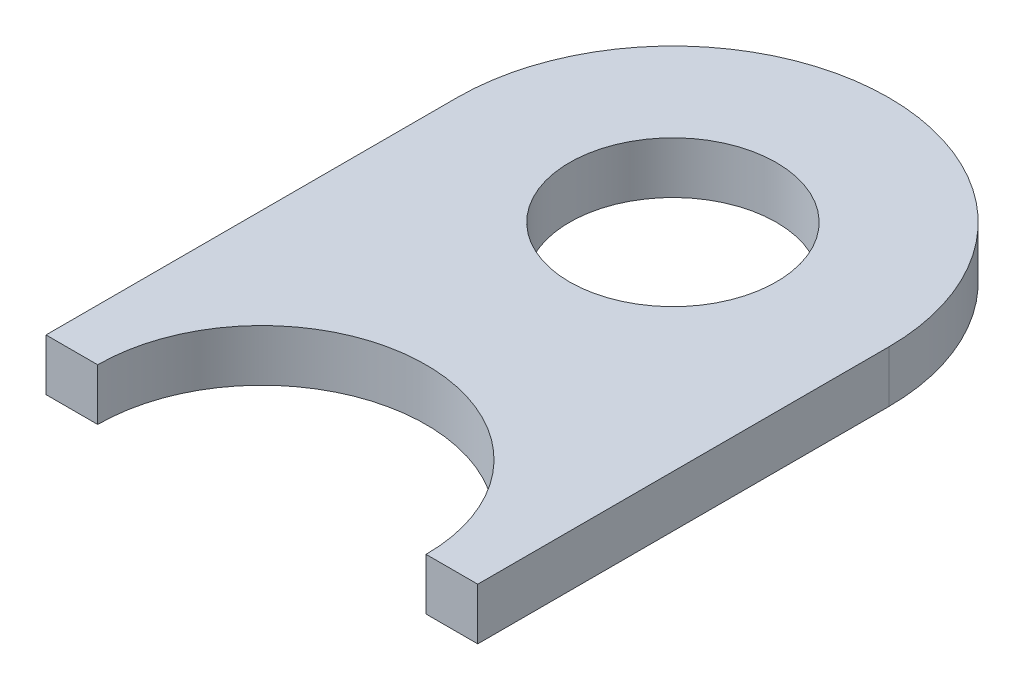
ISO-10303-21;
HEADER;
FILE_DESCRIPTION(('STEP AP214'),'2;1');
FILE_NAME('part.step','',(''),(''),'','','');
FILE_SCHEMA(('AUTOMOTIVE_DESIGN { 1 0 10303 214 1 1 1 1 }'));
ENDSEC;
DATA;
#1=APPLICATION_CONTEXT('core data for automotive mechanical design processes');
#2=APPLICATION_PROTOCOL_DEFINITION('international standard','automotive_design',2000,#1);
#3=PRODUCT_CONTEXT('',#1,'mechanical');
#4=PRODUCT('Part','Part','',(#3));
#5=PRODUCT_RELATED_PRODUCT_CATEGORY('part','',(#4));
#6=PRODUCT_DEFINITION_FORMATION('','',#4);
#7=PRODUCT_DEFINITION_CONTEXT('part definition',#1,'design');
#8=PRODUCT_DEFINITION('design','',#6,#7);
#9=PRODUCT_DEFINITION_SHAPE('','',#8);
#10=(LENGTH_UNIT() NAMED_UNIT(*) SI_UNIT(.MILLI.,.METRE.));
#11=(NAMED_UNIT(*) PLANE_ANGLE_UNIT() SI_UNIT($,.RADIAN.));
#12=(NAMED_UNIT(*) SI_UNIT($,.STERADIAN.) SOLID_ANGLE_UNIT());
#13=UNCERTAINTY_MEASURE_WITH_UNIT(LENGTH_MEASURE(1.E-05),#10,'distance_accuracy_value','');
#14=(GEOMETRIC_REPRESENTATION_CONTEXT(3) GLOBAL_UNCERTAINTY_ASSIGNED_CONTEXT((#13)) GLOBAL_UNIT_ASSIGNED_CONTEXT((#10,
#11,#12)) REPRESENTATION_CONTEXT('',''));
#15=CARTESIAN_POINT('',(0.,0.,0.));
#16=DIRECTION('',(0.,0.,1.));
#17=DIRECTION('',(1.,0.,0.));
#18=AXIS2_PLACEMENT_3D('',#15,#16,#17);
#19=CARTESIAN_POINT('',(-16.7,4.,0.));
#20=DIRECTION('',(0.,1.,0.));
#21=DIRECTION('',(0.,0.,1.));
#22=AXIS2_PLACEMENT_3D('',#19,#20,#21);
#23=PLANE('',#22);
#24=DIRECTION('',(0.,0.,-1.));
#25=VECTOR('',#24,1.);
#26=CARTESIAN_POINT('',(0.,4.,-31.8));
#27=LINE('',#26,#25);
#28=CARTESIAN_POINT('',(0.,4.,0.));
#29=VERTEX_POINT('',#28);
#30=CARTESIAN_POINT('',(0.,4.,-31.8));
#31=VERTEX_POINT('',#30);
#32=EDGE_CURVE('E137',#29,#31,#27,.T.);
#33=ORIENTED_EDGE('',*,*,#32,.T.);
#34=CARTESIAN_POINT('',(-16.7,4.,-31.8));
#35=DIRECTION('',(0.,1.,0.));
#36=DIRECTION('',(0.,0.,-1.));
#37=AXIS2_PLACEMENT_3D('',#34,#35,#36);
#38=CIRCLE('',#37,16.7);
#39=CARTESIAN_POINT('',(-33.4,4.,-31.8));
#40=VERTEX_POINT('',#39);
#41=EDGE_CURVE('E95',#31,#40,#38,.T.);
#42=ORIENTED_EDGE('',*,*,#41,.T.);
#43=DIRECTION('',(0.,0.,1.));
#44=VECTOR('',#43,1.);
#45=CARTESIAN_POINT('',(-33.4,4.,0.));
#46=LINE('',#45,#44);
#47=CARTESIAN_POINT('',(-33.4,4.,0.));
#48=VERTEX_POINT('',#47);
#49=EDGE_CURVE('E108',#40,#48,#46,.T.);
#50=ORIENTED_EDGE('',*,*,#49,.T.);
#51=DIRECTION('',(1.,0.,0.));
#52=VECTOR('',#51,1.);
#53=CARTESIAN_POINT('',(-29.4,4.,0.));
#54=LINE('',#53,#52);
#55=CARTESIAN_POINT('',(-29.4,4.,0.));
#56=VERTEX_POINT('',#55);
#57=EDGE_CURVE('E102',#48,#56,#54,.T.);
#58=ORIENTED_EDGE('',*,*,#57,.T.);
#59=CARTESIAN_POINT('',(-16.7,4.,0.));
#60=DIRECTION('',(0.,-1.,0.));
#61=DIRECTION('',(0.,0.,1.));
#62=AXIS2_PLACEMENT_3D('',#59,#60,#61);
#63=CIRCLE('',#62,12.7);
#64=CARTESIAN_POINT('',(-4.,4.,0.));
#65=VERTEX_POINT('',#64);
#66=EDGE_CURVE('E106',#56,#65,#63,.T.);
#67=ORIENTED_EDGE('',*,*,#66,.T.);
#68=DIRECTION('',(1.,0.,0.));
#69=VECTOR('',#68,1.);
#70=CARTESIAN_POINT('',(0.,4.,0.));
#71=LINE('',#70,#69);
#72=EDGE_CURVE('E58',#65,#29,#71,.T.);
#73=ORIENTED_EDGE('',*,*,#72,.T.);
#74=EDGE_LOOP('',(#33,#42,#50,#58,#67,#73));
#75=FACE_BOUND('',#74,.T.);
#76=CARTESIAN_POINT('',(-16.7,4.,-31.8));
#77=DIRECTION('',(0.,1.,0.));
#78=DIRECTION('',(0.,0.,1.));
#79=AXIS2_PLACEMENT_3D('',#76,#77,#78);
#80=CIRCLE('',#79,8.);
#81=CARTESIAN_POINT('',(-16.7,4.,-23.8));
#82=VERTEX_POINT('',#81);
#83=EDGE_CURVE('E130',#82,#82,#80,.T.);
#84=ORIENTED_EDGE('',*,*,#83,.F.);
#85=EDGE_LOOP('',(#84));
#86=FACE_BOUND('',#85,.T.);
#87=ADVANCED_FACE('F41',(#75,#86),#23,.T.);
#88=CARTESIAN_POINT('',(-16.7,0.,0.));
#89=DIRECTION('',(0.,1.,0.));
#90=DIRECTION('',(0.,0.,1.));
#91=AXIS2_PLACEMENT_3D('',#88,#89,#90);
#92=PLANE('',#91);
#93=DIRECTION('',(0.,0.,-1.));
#94=VECTOR('',#93,1.);
#95=CARTESIAN_POINT('',(0.,0.,-31.8));
#96=LINE('',#95,#94);
#97=CARTESIAN_POINT('',(0.,0.,0.));
#98=VERTEX_POINT('',#97);
#99=CARTESIAN_POINT('',(0.,0.,-31.8));
#100=VERTEX_POINT('',#99);
#101=EDGE_CURVE('E126',#98,#100,#96,.T.);
#102=ORIENTED_EDGE('',*,*,#101,.F.);
#103=DIRECTION('',(1.,0.,0.));
#104=VECTOR('',#103,1.);
#105=CARTESIAN_POINT('',(0.,0.,0.));
#106=LINE('',#105,#104);
#107=CARTESIAN_POINT('',(-4.,0.,0.));
#108=VERTEX_POINT('',#107);
#109=EDGE_CURVE('E87',#108,#98,#106,.T.);
#110=ORIENTED_EDGE('',*,*,#109,.F.);
#111=CARTESIAN_POINT('',(-16.7,0.,0.));
#112=DIRECTION('',(0.,-1.,0.));
#113=DIRECTION('',(0.,0.,1.));
#114=AXIS2_PLACEMENT_3D('',#111,#112,#113);
#115=CIRCLE('',#114,12.7);
#116=CARTESIAN_POINT('',(-29.4,0.,0.));
#117=VERTEX_POINT('',#116);
#118=EDGE_CURVE('E81',#117,#108,#115,.T.);
#119=ORIENTED_EDGE('',*,*,#118,.F.);
#120=DIRECTION('',(1.,0.,0.));
#121=VECTOR('',#120,1.);
#122=CARTESIAN_POINT('',(-29.4,0.,0.));
#123=LINE('',#122,#121);
#124=CARTESIAN_POINT('',(-33.4,0.,0.));
#125=VERTEX_POINT('',#124);
#126=EDGE_CURVE('E116',#125,#117,#123,.T.);
#127=ORIENTED_EDGE('',*,*,#126,.F.);
#128=DIRECTION('',(0.,0.,1.));
#129=VECTOR('',#128,1.);
#130=CARTESIAN_POINT('',(-33.4,0.,0.));
#131=LINE('',#130,#129);
#132=CARTESIAN_POINT('',(-33.4,0.,-31.8));
#133=VERTEX_POINT('',#132);
#134=EDGE_CURVE('E132',#133,#125,#131,.T.);
#135=ORIENTED_EDGE('',*,*,#134,.F.);
#136=CARTESIAN_POINT('',(-16.7,0.,-31.8));
#137=DIRECTION('',(0.,1.,0.));
#138=DIRECTION('',(0.,0.,-1.));
#139=AXIS2_PLACEMENT_3D('',#136,#137,#138);
#140=CIRCLE('',#139,16.7);
#141=EDGE_CURVE('E129',#100,#133,#140,.T.);
#142=ORIENTED_EDGE('',*,*,#141,.F.);
#143=EDGE_LOOP('',(#102,#110,#119,#127,#135,#142));
#144=FACE_BOUND('',#143,.T.);
#145=CARTESIAN_POINT('',(-16.7,0.,-31.8));
#146=DIRECTION('',(0.,1.,0.));
#147=DIRECTION('',(0.,0.,1.));
#148=AXIS2_PLACEMENT_3D('',#145,#146,#147);
#149=CIRCLE('',#148,8.);
#150=CARTESIAN_POINT('',(-16.7,0.,-23.8));
#151=VERTEX_POINT('',#150);
#152=EDGE_CURVE('E266',#151,#151,#149,.T.);
#153=ORIENTED_EDGE('',*,*,#152,.T.);
#154=EDGE_LOOP('',(#153));
#155=FACE_BOUND('',#154,.T.);
#156=ADVANCED_FACE('F146',(#144,#155),#92,.F.);
#157=CARTESIAN_POINT('',(0.,4.,-31.8));
#158=DIRECTION('',(-1.,0.,0.));
#159=DIRECTION('',(0.,0.,1.));
#160=AXIS2_PLACEMENT_3D('',#157,#158,#159);
#161=PLANE('',#160);
#162=ORIENTED_EDGE('',*,*,#101,.T.);
#163=DIRECTION('',(0.,-1.,0.));
#164=VECTOR('',#163,1.);
#165=CARTESIAN_POINT('',(0.,4.,-31.8));
#166=LINE('',#165,#164);
#167=EDGE_CURVE('E11',#31,#100,#166,.T.);
#168=ORIENTED_EDGE('',*,*,#167,.F.);
#169=ORIENTED_EDGE('',*,*,#32,.F.);
#170=DIRECTION('',(0.,-1.,0.));
#171=VECTOR('',#170,1.);
#172=CARTESIAN_POINT('',(0.,4.,0.));
#173=LINE('',#172,#171);
#174=EDGE_CURVE('E122',#29,#98,#173,.T.);
#175=ORIENTED_EDGE('',*,*,#174,.T.);
#176=EDGE_LOOP('',(#162,#168,#169,#175));
#177=FACE_BOUND('',#176,.T.);
#178=ADVANCED_FACE('F43',(#177),#161,.F.);
#179=CARTESIAN_POINT('',(-16.7,4.,-31.8));
#180=DIRECTION('',(0.,-1.,0.));
#181=DIRECTION('',(0.,0.,-1.));
#182=AXIS2_PLACEMENT_3D('',#179,#180,#181);
#183=CYLINDRICAL_SURFACE('',#182,16.7);
#184=ORIENTED_EDGE('',*,*,#141,.T.);
#185=DIRECTION('',(0.,-1.,0.));
#186=VECTOR('',#185,1.);
#187=CARTESIAN_POINT('',(-33.4,4.,-31.8));
#188=LINE('',#187,#186);
#189=EDGE_CURVE('E50',#40,#133,#188,.T.);
#190=ORIENTED_EDGE('',*,*,#189,.F.);
#191=ORIENTED_EDGE('',*,*,#41,.F.);
#192=ORIENTED_EDGE('',*,*,#167,.T.);
#193=EDGE_LOOP('',(#184,#190,#191,#192));
#194=FACE_BOUND('',#193,.T.);
#195=ADVANCED_FACE('F171',(#194),#183,.T.);
#196=CARTESIAN_POINT('',(-33.4,4.,0.));
#197=DIRECTION('',(1.,0.,0.));
#198=DIRECTION('',(0.,0.,-1.));
#199=AXIS2_PLACEMENT_3D('',#196,#197,#198);
#200=PLANE('',#199);
#201=ORIENTED_EDGE('',*,*,#134,.T.);
#202=DIRECTION('',(0.,-1.,0.));
#203=VECTOR('',#202,1.);
#204=CARTESIAN_POINT('',(-33.4,4.,0.));
#205=LINE('',#204,#203);
#206=EDGE_CURVE('E117',#48,#125,#205,.T.);
#207=ORIENTED_EDGE('',*,*,#206,.F.);
#208=ORIENTED_EDGE('',*,*,#49,.F.);
#209=ORIENTED_EDGE('',*,*,#189,.T.);
#210=EDGE_LOOP('',(#201,#207,#208,#209));
#211=FACE_BOUND('',#210,.T.);
#212=ADVANCED_FACE('F143',(#211),#200,.F.);
#213=CARTESIAN_POINT('',(-29.4,4.,0.));
#214=DIRECTION('',(0.,0.,-1.));
#215=DIRECTION('',(-1.,0.,0.));
#216=AXIS2_PLACEMENT_3D('',#213,#214,#215);
#217=PLANE('',#216);
#218=ORIENTED_EDGE('',*,*,#126,.T.);
#219=DIRECTION('',(0.,-1.,0.));
#220=VECTOR('',#219,1.);
#221=CARTESIAN_POINT('',(-29.4,4.,0.));
#222=LINE('',#221,#220);
#223=EDGE_CURVE('E113',#56,#117,#222,.T.);
#224=ORIENTED_EDGE('',*,*,#223,.F.);
#225=ORIENTED_EDGE('',*,*,#57,.F.);
#226=ORIENTED_EDGE('',*,*,#206,.T.);
#227=EDGE_LOOP('',(#218,#224,#225,#226));
#228=FACE_BOUND('',#227,.T.);
#229=ADVANCED_FACE('F114',(#228),#217,.F.);
#230=CARTESIAN_POINT('',(-16.7,4.,0.));
#231=DIRECTION('',(0.,-1.,0.));
#232=DIRECTION('',(0.,0.,-1.));
#233=AXIS2_PLACEMENT_3D('',#230,#231,#232);
#234=CYLINDRICAL_SURFACE('',#233,12.7);
#235=ORIENTED_EDGE('',*,*,#118,.T.);
#236=DIRECTION('',(0.,-1.,0.));
#237=VECTOR('',#236,1.);
#238=CARTESIAN_POINT('',(-4.,4.,0.));
#239=LINE('',#238,#237);
#240=EDGE_CURVE('E118',#65,#108,#239,.T.);
#241=ORIENTED_EDGE('',*,*,#240,.F.);
#242=ORIENTED_EDGE('',*,*,#66,.F.);
#243=ORIENTED_EDGE('',*,*,#223,.T.);
#244=EDGE_LOOP('',(#235,#241,#242,#243));
#245=FACE_BOUND('',#244,.T.);
#246=ADVANCED_FACE('F120',(#245),#234,.F.);
#247=CARTESIAN_POINT('',(0.,4.,0.));
#248=DIRECTION('',(0.,0.,-1.));
#249=DIRECTION('',(-1.,0.,0.));
#250=AXIS2_PLACEMENT_3D('',#247,#248,#249);
#251=PLANE('',#250);
#252=ORIENTED_EDGE('',*,*,#109,.T.);
#253=ORIENTED_EDGE('',*,*,#174,.F.);
#254=ORIENTED_EDGE('',*,*,#72,.F.);
#255=ORIENTED_EDGE('',*,*,#240,.T.);
#256=EDGE_LOOP('',(#252,#253,#254,#255));
#257=FACE_BOUND('',#256,.T.);
#258=ADVANCED_FACE('F151',(#257),#251,.F.);
#259=CARTESIAN_POINT('',(-16.7,4.,-31.8));
#260=DIRECTION('',(0.,-1.,0.));
#261=DIRECTION('',(0.,0.,-1.));
#262=AXIS2_PLACEMENT_3D('',#259,#260,#261);
#263=CYLINDRICAL_SURFACE('',#262,8.);
#264=ORIENTED_EDGE('',*,*,#83,.T.);
#265=EDGE_LOOP('',(#264));
#266=FACE_BOUND('',#265,.T.);
#267=ORIENTED_EDGE('',*,*,#152,.F.);
#268=EDGE_LOOP('',(#267));
#269=FACE_BOUND('',#268,.T.);
#270=ADVANCED_FACE('F153',(#266,#269),#263,.F.);
#271=CLOSED_SHELL('',(#87,#156,#178,#195,#212,#229,#246,#258,#270));
#272=MANIFOLD_SOLID_BREP('B2',#271);
#273=ADVANCED_BREP_SHAPE_REPRESENTATION('',(#18,#272),#14);
#274=SHAPE_DEFINITION_REPRESENTATION(#9,#273);
ENDSEC;
END-ISO-10303-21;
